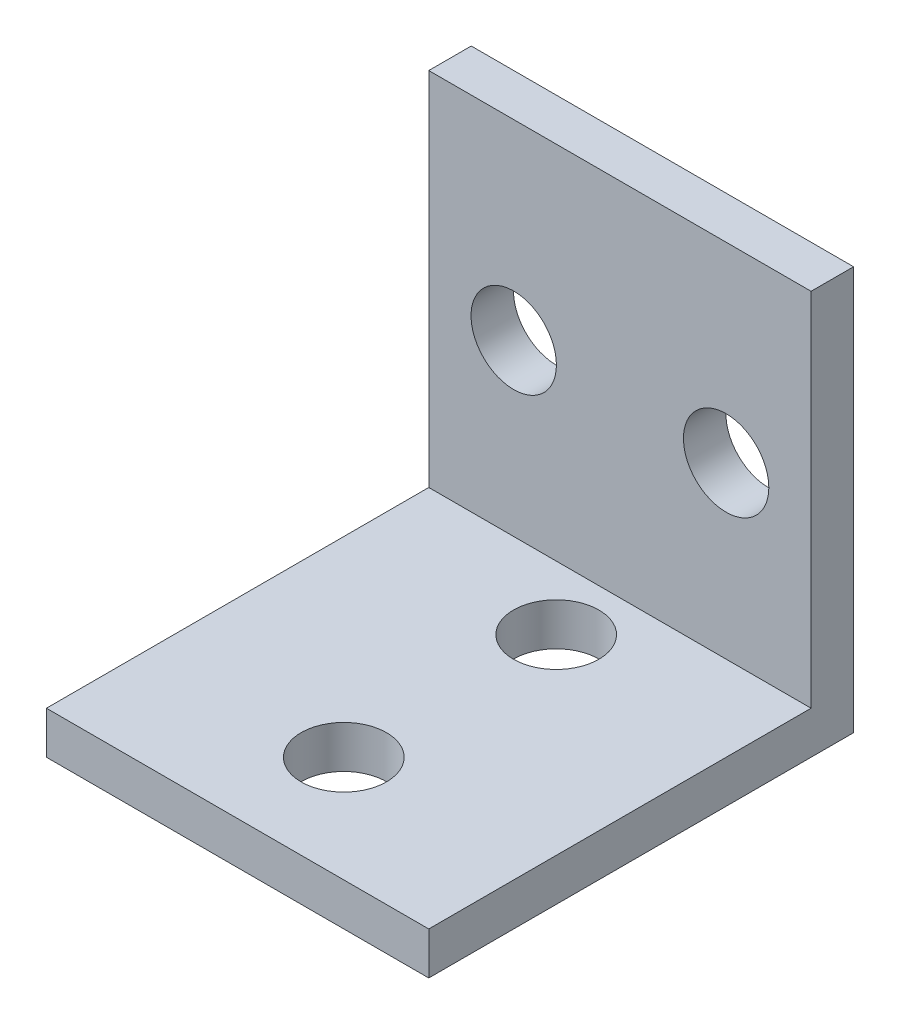
ISO-10303-21;
HEADER;
FILE_DESCRIPTION(('STEP AP214'),'2;1');
FILE_NAME('part.step','',(''),(''),'','','');
FILE_SCHEMA(('AUTOMOTIVE_DESIGN { 1 0 10303 214 1 1 1 1 }'));
ENDSEC;
DATA;
#1=APPLICATION_CONTEXT('core data for automotive mechanical design processes');
#2=APPLICATION_PROTOCOL_DEFINITION('international standard','automotive_design',2000,#1);
#3=PRODUCT_CONTEXT('',#1,'mechanical');
#4=PRODUCT('Part','Part','',(#3));
#5=PRODUCT_RELATED_PRODUCT_CATEGORY('part','',(#4));
#6=PRODUCT_DEFINITION_FORMATION('','',#4);
#7=PRODUCT_DEFINITION_CONTEXT('part definition',#1,'design');
#8=PRODUCT_DEFINITION('design','',#6,#7);
#9=PRODUCT_DEFINITION_SHAPE('','',#8);
#10=(LENGTH_UNIT() NAMED_UNIT(*) SI_UNIT(.MILLI.,.METRE.));
#11=(NAMED_UNIT(*) PLANE_ANGLE_UNIT() SI_UNIT($,.RADIAN.));
#12=(NAMED_UNIT(*) SI_UNIT($,.STERADIAN.) SOLID_ANGLE_UNIT());
#13=UNCERTAINTY_MEASURE_WITH_UNIT(LENGTH_MEASURE(1.E-05),#10,'distance_accuracy_value','');
#14=(GEOMETRIC_REPRESENTATION_CONTEXT(3) GLOBAL_UNCERTAINTY_ASSIGNED_CONTEXT((#13)) GLOBAL_UNIT_ASSIGNED_CONTEXT((#10,
#11,#12)) REPRESENTATION_CONTEXT('',''));
#15=CARTESIAN_POINT('',(0.,0.,0.));
#16=DIRECTION('',(0.,0.,1.));
#17=DIRECTION('',(1.,0.,0.));
#18=AXIS2_PLACEMENT_3D('',#15,#16,#17);
#19=CARTESIAN_POINT('',(0.,24.13,0.));
#20=DIRECTION('',(1.,0.,0.));
#21=DIRECTION('',(0.,0.,-1.));
#22=AXIS2_PLACEMENT_3D('',#19,#20,#21);
#23=PLANE('',#22);
#24=DIRECTION('',(0.,0.,-1.));
#25=VECTOR('',#24,1.);
#26=CARTESIAN_POINT('',(0.,2.54,-22.86));
#27=LINE('',#26,#25);
#28=CARTESIAN_POINT('',(0.,2.54,0.));
#29=VERTEX_POINT('',#28);
#30=CARTESIAN_POINT('',(0.,2.54,-22.86));
#31=VERTEX_POINT('',#30);
#32=EDGE_CURVE('E122',#29,#31,#27,.T.);
#33=ORIENTED_EDGE('',*,*,#32,.T.);
#34=DIRECTION('',(0.,1.,0.));
#35=VECTOR('',#34,1.);
#36=CARTESIAN_POINT('',(0.,24.13,-22.86));
#37=LINE('',#36,#35);
#38=CARTESIAN_POINT('',(0.,24.13,-22.86));
#39=VERTEX_POINT('',#38);
#40=EDGE_CURVE('E133',#31,#39,#37,.T.);
#41=ORIENTED_EDGE('',*,*,#40,.T.);
#42=DIRECTION('',(0.,0.,1.));
#43=VECTOR('',#42,1.);
#44=CARTESIAN_POINT('',(0.,24.13,0.));
#45=LINE('',#44,#43);
#46=CARTESIAN_POINT('',(0.,24.13,-25.4));
#47=VERTEX_POINT('',#46);
#48=EDGE_CURVE('E85',#47,#39,#45,.T.);
#49=ORIENTED_EDGE('',*,*,#48,.F.);
#50=DIRECTION('',(0.,-1.,0.));
#51=VECTOR('',#50,1.);
#52=CARTESIAN_POINT('',(0.,24.13,-25.4));
#53=LINE('',#52,#51);
#54=CARTESIAN_POINT('',(0.,0.,-25.4));
#55=VERTEX_POINT('',#54);
#56=EDGE_CURVE('E78',#47,#55,#53,.T.);
#57=ORIENTED_EDGE('',*,*,#56,.T.);
#58=DIRECTION('',(0.,0.,1.));
#59=VECTOR('',#58,1.);
#60=CARTESIAN_POINT('',(0.,0.,0.));
#61=LINE('',#60,#59);
#62=CARTESIAN_POINT('',(0.,0.,0.));
#63=VERTEX_POINT('',#62);
#64=EDGE_CURVE('E92',#55,#63,#61,.T.);
#65=ORIENTED_EDGE('',*,*,#64,.T.);
#66=DIRECTION('',(0.,-1.,0.));
#67=VECTOR('',#66,1.);
#68=CARTESIAN_POINT('',(0.,24.13,0.));
#69=LINE('',#68,#67);
#70=EDGE_CURVE('E11',#29,#63,#69,.T.);
#71=ORIENTED_EDGE('',*,*,#70,.F.);
#72=EDGE_LOOP('',(#33,#41,#49,#57,#65,#71));
#73=FACE_BOUND('',#72,.T.);
#74=ADVANCED_FACE('F34',(#73),#23,.F.);
#75=CARTESIAN_POINT('',(0.,24.13,0.));
#76=DIRECTION('',(0.,0.,-1.));
#77=DIRECTION('',(-1.,0.,0.));
#78=AXIS2_PLACEMENT_3D('',#75,#76,#77);
#79=PLANE('',#78);
#80=DIRECTION('',(0.,-1.,0.));
#81=VECTOR('',#80,1.);
#82=CARTESIAN_POINT('',(22.86,24.13,0.));
#83=LINE('',#82,#81);
#84=CARTESIAN_POINT('',(22.86,2.54,0.));
#85=VERTEX_POINT('',#84);
#86=CARTESIAN_POINT('',(22.86,0.,0.));
#87=VERTEX_POINT('',#86);
#88=EDGE_CURVE('E41',#85,#87,#83,.T.);
#89=ORIENTED_EDGE('',*,*,#88,.F.);
#90=DIRECTION('',(1.,0.,0.));
#91=VECTOR('',#90,1.);
#92=CARTESIAN_POINT('',(0.,2.54,0.));
#93=LINE('',#92,#91);
#94=EDGE_CURVE('E102',#29,#85,#93,.T.);
#95=ORIENTED_EDGE('',*,*,#94,.F.);
#96=ORIENTED_EDGE('',*,*,#70,.T.);
#97=DIRECTION('',(1.,0.,0.));
#98=VECTOR('',#97,1.);
#99=CARTESIAN_POINT('',(0.,0.,0.));
#100=LINE('',#99,#98);
#101=EDGE_CURVE('E98',#63,#87,#100,.T.);
#102=ORIENTED_EDGE('',*,*,#101,.T.);
#103=EDGE_LOOP('',(#89,#95,#96,#102));
#104=FACE_BOUND('',#103,.T.);
#105=ADVANCED_FACE('F118',(#104),#79,.F.);
#106=CARTESIAN_POINT('',(22.86,24.13,0.));
#107=DIRECTION('',(-1.,0.,0.));
#108=DIRECTION('',(0.,0.,1.));
#109=AXIS2_PLACEMENT_3D('',#106,#107,#108);
#110=PLANE('',#109);
#111=DIRECTION('',(0.,0.,-1.));
#112=VECTOR('',#111,1.);
#113=CARTESIAN_POINT('',(22.86,24.13,0.));
#114=LINE('',#113,#112);
#115=CARTESIAN_POINT('',(22.86,24.13,-22.86));
#116=VERTEX_POINT('',#115);
#117=CARTESIAN_POINT('',(22.86,24.13,-25.4));
#118=VERTEX_POINT('',#117);
#119=EDGE_CURVE('E136',#116,#118,#114,.T.);
#120=ORIENTED_EDGE('',*,*,#119,.F.);
#121=DIRECTION('',(0.,1.,0.));
#122=VECTOR('',#121,1.);
#123=CARTESIAN_POINT('',(22.86,24.13,-22.86));
#124=LINE('',#123,#122);
#125=CARTESIAN_POINT('',(22.86,2.54,-22.86));
#126=VERTEX_POINT('',#125);
#127=EDGE_CURVE('E48',#126,#116,#124,.T.);
#128=ORIENTED_EDGE('',*,*,#127,.F.);
#129=DIRECTION('',(0.,0.,-1.));
#130=VECTOR('',#129,1.);
#131=CARTESIAN_POINT('',(22.86,2.54,-22.86));
#132=LINE('',#131,#130);
#133=EDGE_CURVE('E115',#85,#126,#132,.T.);
#134=ORIENTED_EDGE('',*,*,#133,.F.);
#135=ORIENTED_EDGE('',*,*,#88,.T.);
#136=DIRECTION('',(0.,0.,-1.));
#137=VECTOR('',#136,1.);
#138=CARTESIAN_POINT('',(22.86,0.,0.));
#139=LINE('',#138,#137);
#140=CARTESIAN_POINT('',(22.86,0.,-25.4));
#141=VERTEX_POINT('',#140);
#142=EDGE_CURVE('E86',#87,#141,#139,.T.);
#143=ORIENTED_EDGE('',*,*,#142,.T.);
#144=DIRECTION('',(0.,-1.,0.));
#145=VECTOR('',#144,1.);
#146=CARTESIAN_POINT('',(22.86,24.13,-25.4));
#147=LINE('',#146,#145);
#148=EDGE_CURVE('E81',#118,#141,#147,.T.);
#149=ORIENTED_EDGE('',*,*,#148,.F.);
#150=EDGE_LOOP('',(#120,#128,#134,#135,#143,#149));
#151=FACE_BOUND('',#150,.T.);
#152=ADVANCED_FACE('F112',(#151),#110,.F.);
#153=CARTESIAN_POINT('',(0.,24.13,-25.4));
#154=DIRECTION('',(0.,0.,1.));
#155=DIRECTION('',(1.,0.,0.));
#156=AXIS2_PLACEMENT_3D('',#153,#154,#155);
#157=PLANE('',#156);
#158=CARTESIAN_POINT('',(17.78,12.7,-25.4));
#159=DIRECTION('',(0.,0.,1.));
#160=DIRECTION('',(1.,0.,0.));
#161=AXIS2_PLACEMENT_3D('',#158,#159,#160);
#162=CIRCLE('',#161,2.5527);
#163=CARTESIAN_POINT('',(20.3327,12.7,-25.4));
#164=VERTEX_POINT('',#163);
#165=EDGE_CURVE('E154',#164,#164,#162,.T.);
#166=ORIENTED_EDGE('',*,*,#165,.T.);
#167=EDGE_LOOP('',(#166));
#168=FACE_BOUND('',#167,.T.);
#169=CARTESIAN_POINT('',(5.08,12.7,-25.4));
#170=DIRECTION('',(0.,0.,1.));
#171=DIRECTION('',(1.,0.,0.));
#172=AXIS2_PLACEMENT_3D('',#169,#170,#171);
#173=CIRCLE('',#172,2.5527);
#174=CARTESIAN_POINT('',(7.6327,12.7,-25.4));
#175=VERTEX_POINT('',#174);
#176=EDGE_CURVE('E162',#175,#175,#173,.T.);
#177=ORIENTED_EDGE('',*,*,#176,.T.);
#178=EDGE_LOOP('',(#177));
#179=FACE_BOUND('',#178,.T.);
#180=DIRECTION('',(-1.,0.,0.));
#181=VECTOR('',#180,1.);
#182=CARTESIAN_POINT('',(0.,0.,-25.4));
#183=LINE('',#182,#181);
#184=EDGE_CURVE('E75',#141,#55,#183,.T.);
#185=ORIENTED_EDGE('',*,*,#184,.T.);
#186=ORIENTED_EDGE('',*,*,#56,.F.);
#187=DIRECTION('',(-1.,0.,0.));
#188=VECTOR('',#187,1.);
#189=CARTESIAN_POINT('',(0.,24.13,-25.4));
#190=LINE('',#189,#188);
#191=EDGE_CURVE('E57',#118,#47,#190,.T.);
#192=ORIENTED_EDGE('',*,*,#191,.F.);
#193=ORIENTED_EDGE('',*,*,#148,.T.);
#194=EDGE_LOOP('',(#185,#186,#192,#193));
#195=FACE_BOUND('',#194,.T.);
#196=ADVANCED_FACE('F77',(#168,#179,#195),#157,.F.);
#197=CARTESIAN_POINT('',(0.,24.13,0.));
#198=DIRECTION('',(0.,-1.,0.));
#199=DIRECTION('',(0.,0.,-1.));
#200=AXIS2_PLACEMENT_3D('',#197,#198,#199);
#201=PLANE('',#200);
#202=ORIENTED_EDGE('',*,*,#48,.T.);
#203=DIRECTION('',(1.,0.,0.));
#204=VECTOR('',#203,1.);
#205=CARTESIAN_POINT('',(0.,24.13,-22.86));
#206=LINE('',#205,#204);
#207=EDGE_CURVE('E146',#39,#116,#206,.T.);
#208=ORIENTED_EDGE('',*,*,#207,.T.);
#209=ORIENTED_EDGE('',*,*,#119,.T.);
#210=ORIENTED_EDGE('',*,*,#191,.T.);
#211=EDGE_LOOP('',(#202,#208,#209,#210));
#212=FACE_BOUND('',#211,.T.);
#213=ADVANCED_FACE('F148',(#212),#201,.F.);
#214=CARTESIAN_POINT('',(0.,0.,0.));
#215=DIRECTION('',(0.,-1.,0.));
#216=DIRECTION('',(0.,0.,-1.));
#217=AXIS2_PLACEMENT_3D('',#214,#215,#216);
#218=PLANE('',#217);
#219=CARTESIAN_POINT('',(11.43,0.,-6.35));
#220=DIRECTION('',(0.,1.,0.));
#221=DIRECTION('',(0.,0.,1.));
#222=AXIS2_PLACEMENT_3D('',#219,#220,#221);
#223=CIRCLE('',#222,2.5527);
#224=CARTESIAN_POINT('',(11.43,0.,-3.7973));
#225=VERTEX_POINT('',#224);
#226=EDGE_CURVE('E137',#225,#225,#223,.T.);
#227=ORIENTED_EDGE('',*,*,#226,.T.);
#228=EDGE_LOOP('',(#227));
#229=FACE_BOUND('',#228,.T.);
#230=CARTESIAN_POINT('',(11.43,0.,-19.05));
#231=DIRECTION('',(0.,1.,0.));
#232=DIRECTION('',(0.,0.,1.));
#233=AXIS2_PLACEMENT_3D('',#230,#231,#232);
#234=CIRCLE('',#233,2.5527);
#235=CARTESIAN_POINT('',(11.43,0.,-16.4973));
#236=VERTEX_POINT('',#235);
#237=EDGE_CURVE('E153',#236,#236,#234,.T.);
#238=ORIENTED_EDGE('',*,*,#237,.T.);
#239=EDGE_LOOP('',(#238));
#240=FACE_BOUND('',#239,.T.);
#241=ORIENTED_EDGE('',*,*,#64,.F.);
#242=ORIENTED_EDGE('',*,*,#184,.F.);
#243=ORIENTED_EDGE('',*,*,#142,.F.);
#244=ORIENTED_EDGE('',*,*,#101,.F.);
#245=EDGE_LOOP('',(#241,#242,#243,#244));
#246=FACE_BOUND('',#245,.T.);
#247=ADVANCED_FACE('F96',(#229,#240,#246),#218,.T.);
#248=CARTESIAN_POINT('',(0.,24.13,-22.86));
#249=DIRECTION('',(0.,0.,-1.));
#250=DIRECTION('',(0.,1.,0.));
#251=AXIS2_PLACEMENT_3D('',#248,#249,#250);
#252=PLANE('',#251);
#253=CARTESIAN_POINT('',(17.78,12.7,-22.86));
#254=DIRECTION('',(0.,0.,1.));
#255=DIRECTION('',(1.,0.,0.));
#256=AXIS2_PLACEMENT_3D('',#253,#254,#255);
#257=CIRCLE('',#256,2.5527);
#258=CARTESIAN_POINT('',(20.3327,12.7,-22.86));
#259=VERTEX_POINT('',#258);
#260=EDGE_CURVE('E165',#259,#259,#257,.T.);
#261=ORIENTED_EDGE('',*,*,#260,.F.);
#262=EDGE_LOOP('',(#261));
#263=FACE_BOUND('',#262,.T.);
#264=CARTESIAN_POINT('',(5.08,12.7,-22.86));
#265=DIRECTION('',(0.,0.,1.));
#266=DIRECTION('',(1.,0.,0.));
#267=AXIS2_PLACEMENT_3D('',#264,#265,#266);
#268=CIRCLE('',#267,2.5527);
#269=CARTESIAN_POINT('',(7.6327,12.7,-22.86));
#270=VERTEX_POINT('',#269);
#271=EDGE_CURVE('E159',#270,#270,#268,.T.);
#272=ORIENTED_EDGE('',*,*,#271,.F.);
#273=EDGE_LOOP('',(#272));
#274=FACE_BOUND('',#273,.T.);
#275=ORIENTED_EDGE('',*,*,#127,.T.);
#276=ORIENTED_EDGE('',*,*,#207,.F.);
#277=ORIENTED_EDGE('',*,*,#40,.F.);
#278=DIRECTION('',(1.,0.,0.));
#279=VECTOR('',#278,1.);
#280=CARTESIAN_POINT('',(0.,2.54,-22.86));
#281=LINE('',#280,#279);
#282=EDGE_CURVE('E99',#31,#126,#281,.T.);
#283=ORIENTED_EDGE('',*,*,#282,.T.);
#284=EDGE_LOOP('',(#275,#276,#277,#283));
#285=FACE_BOUND('',#284,.T.);
#286=ADVANCED_FACE('F132',(#263,#274,#285),#252,.F.);
#287=CARTESIAN_POINT('',(0.,2.54,-22.86));
#288=DIRECTION('',(0.,-1.,0.));
#289=DIRECTION('',(0.,0.,-1.));
#290=AXIS2_PLACEMENT_3D('',#287,#288,#289);
#291=PLANE('',#290);
#292=CARTESIAN_POINT('',(11.43,2.54,-6.35));
#293=DIRECTION('',(0.,1.,0.));
#294=DIRECTION('',(0.,0.,1.));
#295=AXIS2_PLACEMENT_3D('',#292,#293,#294);
#296=CIRCLE('',#295,2.5527);
#297=CARTESIAN_POINT('',(11.43,2.54,-3.7973));
#298=VERTEX_POINT('',#297);
#299=EDGE_CURVE('E140',#298,#298,#296,.T.);
#300=ORIENTED_EDGE('',*,*,#299,.F.);
#301=EDGE_LOOP('',(#300));
#302=FACE_BOUND('',#301,.T.);
#303=CARTESIAN_POINT('',(11.43,2.54,-19.05));
#304=DIRECTION('',(0.,1.,0.));
#305=DIRECTION('',(0.,0.,1.));
#306=AXIS2_PLACEMENT_3D('',#303,#304,#305);
#307=CIRCLE('',#306,2.5527);
#308=CARTESIAN_POINT('',(11.43,2.54,-16.4973));
#309=VERTEX_POINT('',#308);
#310=EDGE_CURVE('E150',#309,#309,#307,.T.);
#311=ORIENTED_EDGE('',*,*,#310,.F.);
#312=EDGE_LOOP('',(#311));
#313=FACE_BOUND('',#312,.T.);
#314=ORIENTED_EDGE('',*,*,#133,.T.);
#315=ORIENTED_EDGE('',*,*,#282,.F.);
#316=ORIENTED_EDGE('',*,*,#32,.F.);
#317=ORIENTED_EDGE('',*,*,#94,.T.);
#318=EDGE_LOOP('',(#314,#315,#316,#317));
#319=FACE_BOUND('',#318,.T.);
#320=ADVANCED_FACE('F134',(#302,#313,#319),#291,.F.);
#321=CARTESIAN_POINT('',(11.43,0.,-19.05));
#322=DIRECTION('',(0.,1.,0.));
#323=DIRECTION('',(0.,0.,1.));
#324=AXIS2_PLACEMENT_3D('',#321,#322,#323);
#325=CYLINDRICAL_SURFACE('',#324,2.5527);
#326=ORIENTED_EDGE('',*,*,#237,.F.);
#327=EDGE_LOOP('',(#326));
#328=FACE_BOUND('',#327,.T.);
#329=ORIENTED_EDGE('',*,*,#310,.T.);
#330=EDGE_LOOP('',(#329));
#331=FACE_BOUND('',#330,.T.);
#332=ADVANCED_FACE('F192',(#328,#331),#325,.F.);
#333=CARTESIAN_POINT('',(11.43,0.,-6.35));
#334=DIRECTION('',(0.,1.,0.));
#335=DIRECTION('',(0.,0.,1.));
#336=AXIS2_PLACEMENT_3D('',#333,#334,#335);
#337=CYLINDRICAL_SURFACE('',#336,2.5527);
#338=ORIENTED_EDGE('',*,*,#226,.F.);
#339=EDGE_LOOP('',(#338));
#340=FACE_BOUND('',#339,.T.);
#341=ORIENTED_EDGE('',*,*,#299,.T.);
#342=EDGE_LOOP('',(#341));
#343=FACE_BOUND('',#342,.T.);
#344=ADVANCED_FACE('F186',(#340,#343),#337,.F.);
#345=CARTESIAN_POINT('',(5.08,12.7,-25.4));
#346=DIRECTION('',(0.,0.,1.));
#347=DIRECTION('',(1.,0.,0.));
#348=AXIS2_PLACEMENT_3D('',#345,#346,#347);
#349=CYLINDRICAL_SURFACE('',#348,2.5527);
#350=ORIENTED_EDGE('',*,*,#176,.F.);
#351=EDGE_LOOP('',(#350));
#352=FACE_BOUND('',#351,.T.);
#353=ORIENTED_EDGE('',*,*,#271,.T.);
#354=EDGE_LOOP('',(#353));
#355=FACE_BOUND('',#354,.T.);
#356=ADVANCED_FACE('F176',(#352,#355),#349,.F.);
#357=CARTESIAN_POINT('',(17.78,12.7,-25.4));
#358=DIRECTION('',(0.,0.,1.));
#359=DIRECTION('',(1.,0.,0.));
#360=AXIS2_PLACEMENT_3D('',#357,#358,#359);
#361=CYLINDRICAL_SURFACE('',#360,2.5527);
#362=ORIENTED_EDGE('',*,*,#165,.F.);
#363=EDGE_LOOP('',(#362));
#364=FACE_BOUND('',#363,.T.);
#365=ORIENTED_EDGE('',*,*,#260,.T.);
#366=EDGE_LOOP('',(#365));
#367=FACE_BOUND('',#366,.T.);
#368=ADVANCED_FACE('F173',(#364,#367),#361,.F.);
#369=CLOSED_SHELL('',(#74,#105,#152,#196,#213,#247,#286,#320,#332,#344,#356,#368));
#370=MANIFOLD_SOLID_BREP('B2',#369);
#371=ADVANCED_BREP_SHAPE_REPRESENTATION('',(#18,#370),#14);
#372=SHAPE_DEFINITION_REPRESENTATION(#9,#371);
ENDSEC;
END-ISO-10303-21;
